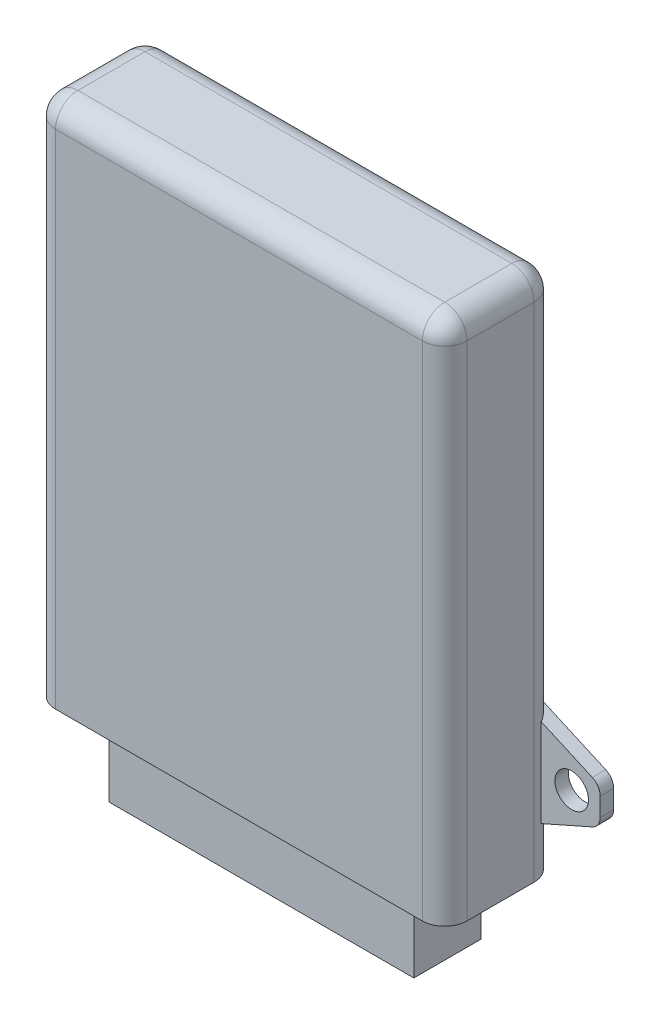
ISO-10303-21;
HEADER;
FILE_DESCRIPTION(('STEP AP214'),'2;1');
FILE_NAME('part.step','',(''),(''),'','','');
FILE_SCHEMA(('AUTOMOTIVE_DESIGN { 1 0 10303 214 1 1 1 1 }'));
ENDSEC;
DATA;
#1=APPLICATION_CONTEXT('core data for automotive mechanical design processes');
#2=APPLICATION_PROTOCOL_DEFINITION('international standard','automotive_design',2000,#1);
#3=PRODUCT_CONTEXT('',#1,'mechanical');
#4=PRODUCT('Part','Part','',(#3));
#5=PRODUCT_RELATED_PRODUCT_CATEGORY('part','',(#4));
#6=PRODUCT_DEFINITION_FORMATION('','',#4);
#7=PRODUCT_DEFINITION_CONTEXT('part definition',#1,'design');
#8=PRODUCT_DEFINITION('design','',#6,#7);
#9=PRODUCT_DEFINITION_SHAPE('','',#8);
#10=(LENGTH_UNIT() NAMED_UNIT(*) SI_UNIT(.MILLI.,.METRE.));
#11=(NAMED_UNIT(*) PLANE_ANGLE_UNIT() SI_UNIT($,.RADIAN.));
#12=(NAMED_UNIT(*) SI_UNIT($,.STERADIAN.) SOLID_ANGLE_UNIT());
#13=UNCERTAINTY_MEASURE_WITH_UNIT(LENGTH_MEASURE(1.E-05),#10,'distance_accuracy_value','');
#14=(GEOMETRIC_REPRESENTATION_CONTEXT(3) GLOBAL_UNCERTAINTY_ASSIGNED_CONTEXT((#13)) GLOBAL_UNIT_ASSIGNED_CONTEXT((#10,
#11,#12)) REPRESENTATION_CONTEXT('',''));
#15=CARTESIAN_POINT('',(0.,0.,0.));
#16=DIRECTION('',(0.,0.,1.));
#17=DIRECTION('',(1.,0.,0.));
#18=AXIS2_PLACEMENT_3D('',#15,#16,#17);
#19=CARTESIAN_POINT('',(-37.9333333333333,60.9946666666666,5.));
#20=DIRECTION('',(0.,1.,0.));
#21=DIRECTION('',(-1.,0.,0.));
#22=AXIS2_PLACEMENT_3D('',#19,#20,#21);
#23=CYLINDRICAL_SURFACE('',#22,5.);
#24=DIRECTION('',(0.,1.,0.));
#25=VECTOR('',#24,1.);
#26=CARTESIAN_POINT('',(-42.5159090282892,60.9946666666666,3.));
#27=LINE('',#26,#25);
#28=CARTESIAN_POINT('',(-42.5159090282892,-41.1726781142199,3.));
#29=VERTEX_POINT('',#28);
#30=CARTESIAN_POINT('',(-42.5159090282892,-21.442223957735,3.));
#31=VERTEX_POINT('',#30);
#32=EDGE_CURVE('E41',#29,#31,#27,.T.);
#33=ORIENTED_EDGE('',*,*,#32,.F.);
#34=CARTESIAN_POINT('',(-37.9333333333333,-43.2073581693863,5.));
#35=DIRECTION('',(0.405801975591513,0.913961025758771,0.));
#36=DIRECTION('',(-0.913961025758771,0.405801975591513,0.));
#37=AXIS2_PLACEMENT_3D('',#34,#35,#36);
#38=ELLIPSE('',#37,5.47069279660913,5.);
#39=CARTESIAN_POINT('',(-37.9333333333333,-43.2073581693863,0.));
#40=VERTEX_POINT('',#39);
#41=EDGE_CURVE('E11',#29,#40,#38,.F.);
#42=ORIENTED_EDGE('',*,*,#41,.T.);
#43=DIRECTION('',(0.,-1.,0.));
#44=VECTOR('',#43,1.);
#45=CARTESIAN_POINT('',(-37.9333333333333,60.9946666666666,0.));
#46=LINE('',#45,#44);
#47=CARTESIAN_POINT('',(-37.9333333333333,-51.3053333333333,0.));
#48=VERTEX_POINT('',#47);
#49=EDGE_CURVE('E389',#48,#40,#46,.F.);
#50=ORIENTED_EDGE('',*,*,#49,.F.);
#51=CARTESIAN_POINT('',(-37.9333333333333,-51.3053333333333,5.));
#52=DIRECTION('',(0.,1.,0.));
#53=DIRECTION('',(0.,0.,1.));
#54=AXIS2_PLACEMENT_3D('',#51,#52,#53);
#55=CIRCLE('',#54,5.);
#56=CARTESIAN_POINT('',(-42.9333333333333,-51.3053333333333,5.));
#57=VERTEX_POINT('',#56);
#58=EDGE_CURVE('E398',#57,#48,#55,.F.);
#59=ORIENTED_EDGE('',*,*,#58,.F.);
#60=DIRECTION('',(0.,-1.,0.));
#61=VECTOR('',#60,1.);
#62=CARTESIAN_POINT('',(-42.9333333333333,-51.3053333333333,5.));
#63=LINE('',#62,#61);
#64=CARTESIAN_POINT('',(-42.9333333333333,60.9946666666666,5.));
#65=VERTEX_POINT('',#64);
#66=EDGE_CURVE('E410',#65,#57,#63,.T.);
#67=ORIENTED_EDGE('',*,*,#66,.F.);
#68=CARTESIAN_POINT('',(-37.9333333333333,60.9946666666667,5.));
#69=DIRECTION('',(0.,1.,0.));
#70=DIRECTION('',(-1.,0.,0.));
#71=AXIS2_PLACEMENT_3D('',#68,#69,#70);
#72=CIRCLE('',#71,5.);
#73=CARTESIAN_POINT('',(-37.9333333333333,60.9946666666667,0.));
#74=VERTEX_POINT('',#73);
#75=EDGE_CURVE('E381',#74,#65,#72,.T.);
#76=ORIENTED_EDGE('',*,*,#75,.F.);
#77=CARTESIAN_POINT('',(-37.9333333333333,-19.4035030737519,0.));
#78=VERTEX_POINT('',#77);
#79=EDGE_CURVE('E376',#78,#74,#46,.F.);
#80=ORIENTED_EDGE('',*,*,#79,.F.);
#81=CARTESIAN_POINT('',(-37.9333333333333,-19.4035030737519,5.));
#82=DIRECTION('',(0.406474844884084,-0.913661972764797,0.));
#83=DIRECTION('',(0.913661972764797,0.406474844884084,0.));
#84=AXIS2_PLACEMENT_3D('',#81,#82,#83);
#85=ELLIPSE('',#84,5.47248342280209,5.);
#86=EDGE_CURVE('E428',#78,#31,#85,.F.);
#87=ORIENTED_EDGE('',*,*,#86,.T.);
#88=EDGE_LOOP('',(#33,#42,#50,#59,#67,#76,#80,#87));
#89=FACE_BOUND('',#88,.T.);
#90=ADVANCED_FACE('F34',(#89),#23,.T.);
#91=CARTESIAN_POINT('',(-42.9333333333333,-51.3053333333333,25.));
#92=DIRECTION('',(0.,1.,0.));
#93=DIRECTION('',(0.,0.,1.));
#94=AXIS2_PLACEMENT_3D('',#91,#92,#93);
#95=PLANE('',#94);
#96=DIRECTION('',(1.,0.,0.));
#97=VECTOR('',#96,1.);
#98=CARTESIAN_POINT('',(-42.9333333333333,-51.3053333333333,0.));
#99=LINE('',#98,#97);
#100=CARTESIAN_POINT('',(44.0666666666667,-51.3053333333333,0.));
#101=VERTEX_POINT('',#100);
#102=EDGE_CURVE('E334',#48,#101,#99,.T.);
#103=ORIENTED_EDGE('',*,*,#102,.T.);
#104=CARTESIAN_POINT('',(44.0666666666667,-51.3053333333333,5.));
#105=DIRECTION('',(0.,1.,0.));
#106=DIRECTION('',(0.,0.,1.));
#107=AXIS2_PLACEMENT_3D('',#104,#105,#106);
#108=CIRCLE('',#107,5.);
#109=CARTESIAN_POINT('',(49.0666666666667,-51.3053333333333,5.));
#110=VERTEX_POINT('',#109);
#111=EDGE_CURVE('E400',#101,#110,#108,.F.);
#112=ORIENTED_EDGE('',*,*,#111,.T.);
#113=DIRECTION('',(0.,0.,-1.));
#114=VECTOR('',#113,1.);
#115=CARTESIAN_POINT('',(49.0666666666667,-51.3053333333333,25.));
#116=LINE('',#115,#114);
#117=CARTESIAN_POINT('',(49.0666666666667,-51.3053333333333,20.));
#118=VERTEX_POINT('',#117);
#119=EDGE_CURVE('E345',#118,#110,#116,.T.);
#120=ORIENTED_EDGE('',*,*,#119,.F.);
#121=CARTESIAN_POINT('',(44.0666666666667,-51.3053333333333,20.));
#122=DIRECTION('',(0.,1.,0.));
#123=DIRECTION('',(0.,0.,1.));
#124=AXIS2_PLACEMENT_3D('',#121,#122,#123);
#125=CIRCLE('',#124,5.);
#126=CARTESIAN_POINT('',(44.0666666666667,-51.3053333333333,25.));
#127=VERTEX_POINT('',#126);
#128=EDGE_CURVE('E360',#118,#127,#125,.F.);
#129=ORIENTED_EDGE('',*,*,#128,.T.);
#130=DIRECTION('',(1.,0.,0.));
#131=VECTOR('',#130,1.);
#132=CARTESIAN_POINT('',(-42.9333333333333,-51.3053333333333,25.));
#133=LINE('',#132,#131);
#134=CARTESIAN_POINT('',(-37.9333333333333,-51.3053333333333,25.));
#135=VERTEX_POINT('',#134);
#136=EDGE_CURVE('E330',#135,#127,#133,.T.);
#137=ORIENTED_EDGE('',*,*,#136,.F.);
#138=CARTESIAN_POINT('',(-37.9333333333333,-51.3053333333333,20.));
#139=DIRECTION('',(0.,1.,0.));
#140=DIRECTION('',(0.,0.,1.));
#141=AXIS2_PLACEMENT_3D('',#138,#139,#140);
#142=CIRCLE('',#141,5.);
#143=CARTESIAN_POINT('',(-42.9333333333333,-51.3053333333333,20.));
#144=VERTEX_POINT('',#143);
#145=EDGE_CURVE('E358',#135,#144,#142,.F.);
#146=ORIENTED_EDGE('',*,*,#145,.T.);
#147=DIRECTION('',(0.,0.,-1.));
#148=VECTOR('',#147,1.);
#149=CARTESIAN_POINT('',(-42.9333333333333,-51.3053333333333,25.));
#150=LINE('',#149,#148);
#151=EDGE_CURVE('E342',#144,#57,#150,.T.);
#152=ORIENTED_EDGE('',*,*,#151,.T.);
#153=ORIENTED_EDGE('',*,*,#58,.T.);
#154=EDGE_LOOP('',(#103,#112,#120,#129,#137,#146,#152,#153));
#155=FACE_BOUND('',#154,.T.);
#156=DIRECTION('',(0.,0.,-1.));
#157=VECTOR('',#156,1.);
#158=CARTESIAN_POINT('',(-31.0333333333333,-51.3053333333333,20.));
#159=LINE('',#158,#157);
#160=CARTESIAN_POINT('',(-31.0333333333333,-51.3053333333333,20.));
#161=VERTEX_POINT('',#160);
#162=CARTESIAN_POINT('',(-31.0333333333333,-51.3053333333333,5.));
#163=VERTEX_POINT('',#162);
#164=EDGE_CURVE('E290',#161,#163,#159,.T.);
#165=ORIENTED_EDGE('',*,*,#164,.F.);
#166=DIRECTION('',(-1.,0.,0.));
#167=VECTOR('',#166,1.);
#168=CARTESIAN_POINT('',(-31.0333333333333,-51.3053333333333,20.));
#169=LINE('',#168,#167);
#170=CARTESIAN_POINT('',(37.1666666666667,-51.3053333333333,20.));
#171=VERTEX_POINT('',#170);
#172=EDGE_CURVE('E301',#171,#161,#169,.T.);
#173=ORIENTED_EDGE('',*,*,#172,.F.);
#174=DIRECTION('',(0.,0.,1.));
#175=VECTOR('',#174,1.);
#176=CARTESIAN_POINT('',(37.1666666666667,-51.3053333333333,20.));
#177=LINE('',#176,#175);
#178=CARTESIAN_POINT('',(37.1666666666667,-51.3053333333333,5.));
#179=VERTEX_POINT('',#178);
#180=EDGE_CURVE('E313',#179,#171,#177,.T.);
#181=ORIENTED_EDGE('',*,*,#180,.F.);
#182=DIRECTION('',(1.,0.,0.));
#183=VECTOR('',#182,1.);
#184=CARTESIAN_POINT('',(-31.0333333333333,-51.3053333333333,5.));
#185=LINE('',#184,#183);
#186=EDGE_CURVE('E310',#163,#179,#185,.T.);
#187=ORIENTED_EDGE('',*,*,#186,.F.);
#188=EDGE_LOOP('',(#165,#173,#181,#187));
#189=FACE_BOUND('',#188,.T.);
#190=ADVANCED_FACE('F450',(#155,#189),#95,.F.);
#191=CARTESIAN_POINT('',(-37.9333333333333,60.9946666666667,25.));
#192=DIRECTION('',(0.,0.,-1.));
#193=DIRECTION('',(-1.,0.,0.));
#194=AXIS2_PLACEMENT_3D('',#191,#192,#193);
#195=CYLINDRICAL_SURFACE('',#194,5.);
#196=DIRECTION('',(0.,0.,-1.));
#197=VECTOR('',#196,1.);
#198=CARTESIAN_POINT('',(-37.9333333333333,65.9946666666667,25.));
#199=LINE('',#198,#197);
#200=CARTESIAN_POINT('',(-37.9333333333333,65.9946666666667,20.));
#201=VERTEX_POINT('',#200);
#202=CARTESIAN_POINT('',(-37.9333333333333,65.9946666666667,5.));
#203=VERTEX_POINT('',#202);
#204=EDGE_CURVE('E333',#201,#203,#199,.T.);
#205=ORIENTED_EDGE('',*,*,#204,.T.);
#206=CARTESIAN_POINT('',(-37.9333333333333,60.9946666666667,5.));
#207=DIRECTION('',(0.,0.,-1.));
#208=DIRECTION('',(-1.,0.,0.));
#209=AXIS2_PLACEMENT_3D('',#206,#207,#208);
#210=CIRCLE('',#209,5.);
#211=EDGE_CURVE('E408',#203,#65,#210,.F.);
#212=ORIENTED_EDGE('',*,*,#211,.T.);
#213=DIRECTION('',(0.,0.,-1.));
#214=VECTOR('',#213,1.);
#215=CARTESIAN_POINT('',(-42.9333333333333,60.9946666666666,25.));
#216=LINE('',#215,#214);
#217=CARTESIAN_POINT('',(-42.9333333333333,60.9946666666666,20.));
#218=VERTEX_POINT('',#217);
#219=EDGE_CURVE('E338',#218,#65,#216,.T.);
#220=ORIENTED_EDGE('',*,*,#219,.F.);
#221=CARTESIAN_POINT('',(-37.9333333333333,60.9946666666667,20.));
#222=DIRECTION('',(0.,0.,-1.));
#223=DIRECTION('',(-1.,0.,0.));
#224=AXIS2_PLACEMENT_3D('',#221,#222,#223);
#225=CIRCLE('',#224,5.);
#226=EDGE_CURVE('E372',#218,#201,#225,.T.);
#227=ORIENTED_EDGE('',*,*,#226,.T.);
#228=EDGE_LOOP('',(#205,#212,#220,#227));
#229=FACE_BOUND('',#228,.T.);
#230=ADVANCED_FACE('F508',(#229),#195,.T.);
#231=CARTESIAN_POINT('',(-42.9333333333333,60.9946666666666,25.));
#232=DIRECTION('',(1.,0.,0.));
#233=DIRECTION('',(0.,1.,0.));
#234=AXIS2_PLACEMENT_3D('',#231,#232,#233);
#235=PLANE('',#234);
#236=ORIENTED_EDGE('',*,*,#219,.T.);
#237=ORIENTED_EDGE('',*,*,#66,.T.);
#238=ORIENTED_EDGE('',*,*,#151,.F.);
#239=DIRECTION('',(0.,-1.,0.));
#240=VECTOR('',#239,1.);
#241=CARTESIAN_POINT('',(-42.9333333333333,60.9946666666666,20.));
#242=LINE('',#241,#240);
#243=EDGE_CURVE('E374',#144,#218,#242,.F.);
#244=ORIENTED_EDGE('',*,*,#243,.T.);
#245=EDGE_LOOP('',(#236,#237,#238,#244));
#246=FACE_BOUND('',#245,.T.);
#247=ADVANCED_FACE('F528',(#246),#235,.F.);
#248=CARTESIAN_POINT('',(49.0666666666667,60.9946666666666,25.));
#249=DIRECTION('',(1.,0.,0.));
#250=DIRECTION('',(0.,1.,0.));
#251=AXIS2_PLACEMENT_3D('',#248,#249,#250);
#252=PLANE('',#251);
#253=ORIENTED_EDGE('',*,*,#119,.T.);
#254=DIRECTION('',(0.,-1.,0.));
#255=VECTOR('',#254,1.);
#256=CARTESIAN_POINT('',(49.0666666666667,60.9946666666666,5.));
#257=LINE('',#256,#255);
#258=CARTESIAN_POINT('',(49.0666666666667,60.9946666666666,5.));
#259=VERTEX_POINT('',#258);
#260=EDGE_CURVE('E402',#110,#259,#257,.F.);
#261=ORIENTED_EDGE('',*,*,#260,.T.);
#262=DIRECTION('',(0.,0.,-1.));
#263=VECTOR('',#262,1.);
#264=CARTESIAN_POINT('',(49.0666666666667,60.9946666666666,25.));
#265=LINE('',#264,#263);
#266=CARTESIAN_POINT('',(49.0666666666667,60.9946666666666,20.));
#267=VERTEX_POINT('',#266);
#268=EDGE_CURVE('E348',#267,#259,#265,.T.);
#269=ORIENTED_EDGE('',*,*,#268,.F.);
#270=DIRECTION('',(0.,-1.,0.));
#271=VECTOR('',#270,1.);
#272=CARTESIAN_POINT('',(49.0666666666667,-51.3053333333333,20.));
#273=LINE('',#272,#271);
#274=EDGE_CURVE('E341',#267,#118,#273,.T.);
#275=ORIENTED_EDGE('',*,*,#274,.T.);
#276=EDGE_LOOP('',(#253,#261,#269,#275));
#277=FACE_BOUND('',#276,.T.);
#278=ADVANCED_FACE('F461',(#277),#252,.T.);
#279=CARTESIAN_POINT('',(44.0666666666667,60.9946666666667,25.));
#280=DIRECTION('',(0.,0.,-1.));
#281=DIRECTION('',(-1.,0.,0.));
#282=AXIS2_PLACEMENT_3D('',#279,#280,#281);
#283=CYLINDRICAL_SURFACE('',#282,5.);
#284=ORIENTED_EDGE('',*,*,#268,.T.);
#285=CARTESIAN_POINT('',(44.0666666666667,60.9946666666667,5.));
#286=DIRECTION('',(0.,0.,-1.));
#287=DIRECTION('',(-1.,0.,0.));
#288=AXIS2_PLACEMENT_3D('',#285,#286,#287);
#289=CIRCLE('',#288,5.);
#290=CARTESIAN_POINT('',(44.0666666666666,65.9946666666667,5.));
#291=VERTEX_POINT('',#290);
#292=EDGE_CURVE('E404',#259,#291,#289,.F.);
#293=ORIENTED_EDGE('',*,*,#292,.T.);
#294=DIRECTION('',(0.,0.,-1.));
#295=VECTOR('',#294,1.);
#296=CARTESIAN_POINT('',(44.0666666666666,65.9946666666667,25.));
#297=LINE('',#296,#295);
#298=CARTESIAN_POINT('',(44.0666666666666,65.9946666666667,20.));
#299=VERTEX_POINT('',#298);
#300=EDGE_CURVE('E351',#299,#291,#297,.T.);
#301=ORIENTED_EDGE('',*,*,#300,.F.);
#302=CARTESIAN_POINT('',(44.0666666666667,60.9946666666667,20.));
#303=DIRECTION('',(0.,0.,-1.));
#304=DIRECTION('',(-1.,0.,0.));
#305=AXIS2_PLACEMENT_3D('',#302,#303,#304);
#306=CIRCLE('',#305,5.);
#307=EDGE_CURVE('E368',#299,#267,#306,.T.);
#308=ORIENTED_EDGE('',*,*,#307,.T.);
#309=EDGE_LOOP('',(#284,#293,#301,#308));
#310=FACE_BOUND('',#309,.T.);
#311=ADVANCED_FACE('F493',(#310),#283,.T.);
#312=CARTESIAN_POINT('',(-37.9333333333333,65.9946666666667,25.));
#313=DIRECTION('',(0.,1.,0.));
#314=DIRECTION('',(0.,0.,1.));
#315=AXIS2_PLACEMENT_3D('',#312,#313,#314);
#316=PLANE('',#315);
#317=ORIENTED_EDGE('',*,*,#300,.T.);
#318=DIRECTION('',(1.,0.,0.));
#319=VECTOR('',#318,1.);
#320=CARTESIAN_POINT('',(-37.9333333333333,65.9946666666667,5.));
#321=LINE('',#320,#319);
#322=EDGE_CURVE('E406',#291,#203,#321,.F.);
#323=ORIENTED_EDGE('',*,*,#322,.T.);
#324=ORIENTED_EDGE('',*,*,#204,.F.);
#325=DIRECTION('',(1.,0.,0.));
#326=VECTOR('',#325,1.);
#327=CARTESIAN_POINT('',(44.0666666666666,65.9946666666667,20.));
#328=LINE('',#327,#326);
#329=EDGE_CURVE('E370',#201,#299,#328,.T.);
#330=ORIENTED_EDGE('',*,*,#329,.T.);
#331=EDGE_LOOP('',(#317,#323,#324,#330));
#332=FACE_BOUND('',#331,.T.);
#333=ADVANCED_FACE('F490',(#332),#316,.T.);
#334=CARTESIAN_POINT('',(-37.9333333333333,60.9946666666667,25.));
#335=DIRECTION('',(0.,0.,-1.));
#336=DIRECTION('',(-1.,0.,0.));
#337=AXIS2_PLACEMENT_3D('',#334,#335,#336);
#338=PLANE('',#337);
#339=ORIENTED_EDGE('',*,*,#136,.T.);
#340=DIRECTION('',(0.,-1.,0.));
#341=VECTOR('',#340,1.);
#342=CARTESIAN_POINT('',(44.0666666666667,60.9946666666666,25.));
#343=LINE('',#342,#341);
#344=CARTESIAN_POINT('',(44.0666666666667,60.9946666666667,25.));
#345=VERTEX_POINT('',#344);
#346=EDGE_CURVE('E366',#127,#345,#343,.F.);
#347=ORIENTED_EDGE('',*,*,#346,.T.);
#348=DIRECTION('',(1.,0.,0.));
#349=VECTOR('',#348,1.);
#350=CARTESIAN_POINT('',(-37.9333333333333,60.9946666666667,25.));
#351=LINE('',#350,#349);
#352=CARTESIAN_POINT('',(-37.9333333333333,60.9946666666667,25.));
#353=VERTEX_POINT('',#352);
#354=EDGE_CURVE('E364',#345,#353,#351,.F.);
#355=ORIENTED_EDGE('',*,*,#354,.T.);
#356=DIRECTION('',(0.,-1.,0.));
#357=VECTOR('',#356,1.);
#358=CARTESIAN_POINT('',(-37.9333333333333,60.9946666666667,25.));
#359=LINE('',#358,#357);
#360=EDGE_CURVE('E362',#353,#135,#359,.T.);
#361=ORIENTED_EDGE('',*,*,#360,.T.);
#362=EDGE_LOOP('',(#339,#347,#355,#361));
#363=FACE_BOUND('',#362,.T.);
#364=ADVANCED_FACE('F471',(#363),#338,.F.);
#365=CARTESIAN_POINT('',(-37.9333333333333,60.9946666666667,0.));
#366=DIRECTION('',(0.,0.,-1.));
#367=DIRECTION('',(-1.,0.,0.));
#368=AXIS2_PLACEMENT_3D('',#365,#366,#367);
#369=PLANE('',#368);
#370=ORIENTED_EDGE('',*,*,#49,.T.);
#371=DIRECTION('',(0.913961025758771,-0.405801975591513,0.));
#372=VECTOR('',#371,1.);
#373=CARTESIAN_POINT('',(-53.9300748398216,-36.1047475291016,0.));
#374=LINE('',#373,#372);
#375=CARTESIAN_POINT('',(-53.9300748398216,-36.1047475291016,0.));
#376=VERTEX_POINT('',#375);
#377=EDGE_CURVE('E242',#376,#40,#374,.T.);
#378=ORIENTED_EDGE('',*,*,#377,.F.);
#379=CARTESIAN_POINT('',(-52.712668913047,-33.3628644518253,0.));
#380=DIRECTION('',(0.,0.,1.));
#381=DIRECTION('',(-1.,0.,0.));
#382=AXIS2_PLACEMENT_3D('',#379,#380,#381);
#383=CIRCLE('',#382,3.);
#384=CARTESIAN_POINT('',(-55.712668913047,-33.3628644518253,0.));
#385=VERTEX_POINT('',#384);
#386=EDGE_CURVE('E224',#385,#376,#383,.T.);
#387=ORIENTED_EDGE('',*,*,#386,.F.);
#388=DIRECTION('',(0.,-1.,0.));
#389=VECTOR('',#388,1.);
#390=CARTESIAN_POINT('',(-55.712668913047,-29.2621033063926,0.));
#391=LINE('',#390,#389);
#392=CARTESIAN_POINT('',(-55.712668913047,-29.2621033063926,0.));
#393=VERTEX_POINT('',#392);
#394=EDGE_CURVE('E246',#393,#385,#391,.T.);
#395=ORIENTED_EDGE('',*,*,#394,.F.);
#396=CARTESIAN_POINT('',(-52.712668913047,-29.2621033063926,0.));
#397=DIRECTION('',(0.,0.,1.));
#398=DIRECTION('',(-1.,0.,0.));
#399=AXIS2_PLACEMENT_3D('',#396,#397,#398);
#400=CIRCLE('',#399,3.);
#401=CARTESIAN_POINT('',(-53.9320934476993,-26.5211173880982,0.));
#402=VERTEX_POINT('',#401);
#403=EDGE_CURVE('E232',#402,#393,#400,.T.);
#404=ORIENTED_EDGE('',*,*,#403,.F.);
#405=DIRECTION('',(-0.913661972764797,-0.406474844884084,0.));
#406=VECTOR('',#405,1.);
#407=CARTESIAN_POINT('',(-53.9320934476993,-26.5211173880982,0.));
#408=LINE('',#407,#406);
#409=EDGE_CURVE('E230',#78,#402,#408,.T.);
#410=ORIENTED_EDGE('',*,*,#409,.F.);
#411=ORIENTED_EDGE('',*,*,#79,.T.);
#412=DIRECTION('',(1.,0.,0.));
#413=VECTOR('',#412,1.);
#414=CARTESIAN_POINT('',(-37.9333333333333,60.9946666666667,0.));
#415=LINE('',#414,#413);
#416=CARTESIAN_POINT('',(44.0666666666667,60.9946666666667,0.));
#417=VERTEX_POINT('',#416);
#418=EDGE_CURVE('E392',#74,#417,#415,.T.);
#419=ORIENTED_EDGE('',*,*,#418,.T.);
#420=DIRECTION('',(0.,-1.,0.));
#421=VECTOR('',#420,1.);
#422=CARTESIAN_POINT('',(44.0666666666667,60.9946666666667,0.));
#423=LINE('',#422,#421);
#424=CARTESIAN_POINT('',(44.0666666666667,-19.4035030737519,0.));
#425=VERTEX_POINT('',#424);
#426=EDGE_CURVE('E395',#417,#425,#423,.T.);
#427=ORIENTED_EDGE('',*,*,#426,.T.);
#428=DIRECTION('',(0.913661972764797,-0.406474844884084,0.));
#429=VECTOR('',#428,1.);
#430=CARTESIAN_POINT('',(60.0654267810326,-26.5211173880982,0.));
#431=LINE('',#430,#429);
#432=CARTESIAN_POINT('',(60.0654267810326,-26.5211173880982,0.));
#433=VERTEX_POINT('',#432);
#434=EDGE_CURVE('E279',#425,#433,#431,.T.);
#435=ORIENTED_EDGE('',*,*,#434,.T.);
#436=CARTESIAN_POINT('',(58.8460022463804,-29.2621033063926,0.));
#437=DIRECTION('',(0.,0.,-1.));
#438=DIRECTION('',(1.,0.,0.));
#439=AXIS2_PLACEMENT_3D('',#436,#437,#438);
#440=CIRCLE('',#439,3.);
#441=CARTESIAN_POINT('',(61.8460022463804,-29.2621033063926,0.));
#442=VERTEX_POINT('',#441);
#443=EDGE_CURVE('E281',#433,#442,#440,.T.);
#444=ORIENTED_EDGE('',*,*,#443,.T.);
#445=DIRECTION('',(0.,-1.,0.));
#446=VECTOR('',#445,1.);
#447=CARTESIAN_POINT('',(61.8460022463804,-29.2621033063926,0.));
#448=LINE('',#447,#446);
#449=CARTESIAN_POINT('',(61.8460022463804,-33.3628644518253,0.));
#450=VERTEX_POINT('',#449);
#451=EDGE_CURVE('E284',#442,#450,#448,.T.);
#452=ORIENTED_EDGE('',*,*,#451,.T.);
#453=CARTESIAN_POINT('',(58.8460022463804,-33.3628644518253,0.));
#454=DIRECTION('',(0.,0.,-1.));
#455=DIRECTION('',(1.,0.,0.));
#456=AXIS2_PLACEMENT_3D('',#453,#454,#455);
#457=CIRCLE('',#456,3.);
#458=CARTESIAN_POINT('',(60.0634081731549,-36.1047475291016,0.));
#459=VERTEX_POINT('',#458);
#460=EDGE_CURVE('E266',#450,#459,#457,.T.);
#461=ORIENTED_EDGE('',*,*,#460,.T.);
#462=DIRECTION('',(-0.913961025758771,-0.405801975591513,0.));
#463=VECTOR('',#462,1.);
#464=CARTESIAN_POINT('',(60.0634081731549,-36.1047475291016,0.));
#465=LINE('',#464,#463);
#466=CARTESIAN_POINT('',(44.0666666666667,-43.2073581693862,0.));
#467=VERTEX_POINT('',#466);
#468=EDGE_CURVE('E56',#459,#467,#465,.T.);
#469=ORIENTED_EDGE('',*,*,#468,.T.);
#470=EDGE_CURVE('E394',#467,#101,#423,.T.);
#471=ORIENTED_EDGE('',*,*,#470,.T.);
#472=ORIENTED_EDGE('',*,*,#102,.F.);
#473=EDGE_LOOP('',(#370,#378,#387,#395,#404,#410,#411,#419,#427,#435,#444,#452,#461,#469,#471,#472));
#474=FACE_BOUND('',#473,.T.);
#475=CARTESIAN_POINT('',(-49.3230011231902,-31.312483879109,0.));
#476=DIRECTION('',(0.,0.,1.));
#477=DIRECTION('',(1.,0.,0.));
#478=AXIS2_PLACEMENT_3D('',#475,#476,#477);
#479=CIRCLE('',#478,3.75);
#480=CARTESIAN_POINT('',(-45.5730011231902,-31.312483879109,0.));
#481=VERTEX_POINT('',#480);
#482=EDGE_CURVE('E235',#481,#481,#479,.T.);
#483=ORIENTED_EDGE('',*,*,#482,.T.);
#484=EDGE_LOOP('',(#483));
#485=FACE_BOUND('',#484,.T.);
#486=CARTESIAN_POINT('',(55.4563344565235,-31.3124838791089,0.));
#487=DIRECTION('',(0.,0.,-1.));
#488=DIRECTION('',(-1.,0.,0.));
#489=AXIS2_PLACEMENT_3D('',#486,#487,#488);
#490=CIRCLE('',#489,3.75);
#491=CARTESIAN_POINT('',(51.7063344565235,-31.3124838791089,0.));
#492=VERTEX_POINT('',#491);
#493=EDGE_CURVE('E252',#492,#492,#490,.T.);
#494=ORIENTED_EDGE('',*,*,#493,.F.);
#495=EDGE_LOOP('',(#494));
#496=FACE_BOUND('',#495,.T.);
#497=ADVANCED_FACE('F436',(#474,#485,#496),#369,.T.);
#498=CARTESIAN_POINT('',(-37.9333333333333,60.9946666666667,20.));
#499=DIRECTION('',(0.,-1.,0.));
#500=DIRECTION('',(1.,0.,0.));
#501=AXIS2_PLACEMENT_3D('',#498,#499,#500);
#502=CYLINDRICAL_SURFACE('',#501,5.);
#503=CARTESIAN_POINT('',(-37.9333333333333,60.9946666666666,20.));
#504=DIRECTION('',(0.,1.,0.));
#505=DIRECTION('',(0.,0.,1.));
#506=AXIS2_PLACEMENT_3D('',#503,#504,#505);
#507=CIRCLE('',#506,5.);
#508=EDGE_CURVE('E337',#218,#353,#507,.T.);
#509=ORIENTED_EDGE('',*,*,#508,.F.);
#510=ORIENTED_EDGE('',*,*,#243,.F.);
#511=ORIENTED_EDGE('',*,*,#145,.F.);
#512=ORIENTED_EDGE('',*,*,#360,.F.);
#513=EDGE_LOOP('',(#509,#510,#511,#512));
#514=FACE_BOUND('',#513,.T.);
#515=ADVANCED_FACE('F476',(#514),#502,.T.);
#516=CARTESIAN_POINT('',(-37.9333333333333,60.9946666666667,20.));
#517=DIRECTION('',(0.,0.,-1.));
#518=DIRECTION('',(-1.,0.,0.));
#519=AXIS2_PLACEMENT_3D('',#516,#517,#518);
#520=SPHERICAL_SURFACE('',#519,5.);
#521=ORIENTED_EDGE('',*,*,#226,.F.);
#522=ORIENTED_EDGE('',*,*,#508,.T.);
#523=CARTESIAN_POINT('',(-37.9333333333333,60.9946666666667,20.));
#524=DIRECTION('',(1.,0.,0.));
#525=DIRECTION('',(0.,1.,0.));
#526=AXIS2_PLACEMENT_3D('',#523,#524,#525);
#527=CIRCLE('',#526,5.);
#528=EDGE_CURVE('E384',#201,#353,#527,.T.);
#529=ORIENTED_EDGE('',*,*,#528,.F.);
#530=EDGE_LOOP('',(#521,#522,#529));
#531=FACE_BOUND('',#530,.T.);
#532=ADVANCED_FACE('F481',(#531),#520,.T.);
#533=CARTESIAN_POINT('',(-37.9333333333333,60.9946666666667,20.));
#534=DIRECTION('',(-1.,0.,0.));
#535=DIRECTION('',(0.,0.,1.));
#536=AXIS2_PLACEMENT_3D('',#533,#534,#535);
#537=CYLINDRICAL_SURFACE('',#536,5.);
#538=CARTESIAN_POINT('',(44.0666666666666,60.9946666666667,20.));
#539=DIRECTION('',(1.,0.,0.));
#540=DIRECTION('',(0.,0.,-1.));
#541=AXIS2_PLACEMENT_3D('',#538,#539,#540);
#542=CIRCLE('',#541,5.);
#543=EDGE_CURVE('E380',#299,#345,#542,.T.);
#544=ORIENTED_EDGE('',*,*,#543,.F.);
#545=ORIENTED_EDGE('',*,*,#329,.F.);
#546=ORIENTED_EDGE('',*,*,#528,.T.);
#547=ORIENTED_EDGE('',*,*,#354,.F.);
#548=EDGE_LOOP('',(#544,#545,#546,#547));
#549=FACE_BOUND('',#548,.T.);
#550=ADVANCED_FACE('F485',(#549),#537,.T.);
#551=CARTESIAN_POINT('',(44.0666666666667,60.9946666666667,20.));
#552=DIRECTION('',(0.,0.,-1.));
#553=DIRECTION('',(-1.,0.,0.));
#554=AXIS2_PLACEMENT_3D('',#551,#552,#553);
#555=SPHERICAL_SURFACE('',#554,5.);
#556=ORIENTED_EDGE('',*,*,#307,.F.);
#557=ORIENTED_EDGE('',*,*,#543,.T.);
#558=CARTESIAN_POINT('',(44.0666666666667,60.9946666666667,20.));
#559=DIRECTION('',(0.,-1.,0.));
#560=DIRECTION('',(1.,0.,0.));
#561=AXIS2_PLACEMENT_3D('',#558,#559,#560);
#562=CIRCLE('',#561,5.);
#563=EDGE_CURVE('E377',#267,#345,#562,.T.);
#564=ORIENTED_EDGE('',*,*,#563,.F.);
#565=EDGE_LOOP('',(#556,#557,#564));
#566=FACE_BOUND('',#565,.T.);
#567=ADVANCED_FACE('F518',(#566),#555,.T.);
#568=CARTESIAN_POINT('',(44.0666666666667,60.9946666666666,20.));
#569=DIRECTION('',(0.,1.,0.));
#570=DIRECTION('',(-1.,0.,0.));
#571=AXIS2_PLACEMENT_3D('',#568,#569,#570);
#572=CYLINDRICAL_SURFACE('',#571,5.);
#573=ORIENTED_EDGE('',*,*,#563,.T.);
#574=ORIENTED_EDGE('',*,*,#346,.F.);
#575=ORIENTED_EDGE('',*,*,#128,.F.);
#576=ORIENTED_EDGE('',*,*,#274,.F.);
#577=EDGE_LOOP('',(#573,#574,#575,#576));
#578=FACE_BOUND('',#577,.T.);
#579=ADVANCED_FACE('F466',(#578),#572,.T.);
#580=CARTESIAN_POINT('',(-37.9333333333333,60.9946666666667,5.));
#581=DIRECTION('',(0.,0.,-1.));
#582=DIRECTION('',(-1.,0.,0.));
#583=AXIS2_PLACEMENT_3D('',#580,#581,#582);
#584=SPHERICAL_SURFACE('',#583,5.);
#585=ORIENTED_EDGE('',*,*,#75,.T.);
#586=ORIENTED_EDGE('',*,*,#211,.F.);
#587=CARTESIAN_POINT('',(-37.9333333333333,60.9946666666667,5.));
#588=DIRECTION('',(1.,0.,0.));
#589=DIRECTION('',(0.,1.,0.));
#590=AXIS2_PLACEMENT_3D('',#587,#588,#589);
#591=CIRCLE('',#590,5.);
#592=EDGE_CURVE('E418',#74,#203,#591,.T.);
#593=ORIENTED_EDGE('',*,*,#592,.F.);
#594=EDGE_LOOP('',(#585,#586,#593));
#595=FACE_BOUND('',#594,.T.);
#596=ADVANCED_FACE('F511',(#595),#584,.T.);
#597=CARTESIAN_POINT('',(-37.9333333333333,60.9946666666667,5.));
#598=DIRECTION('',(1.,0.,0.));
#599=DIRECTION('',(0.,0.,-1.));
#600=AXIS2_PLACEMENT_3D('',#597,#598,#599);
#601=CYLINDRICAL_SURFACE('',#600,5.);
#602=ORIENTED_EDGE('',*,*,#592,.T.);
#603=ORIENTED_EDGE('',*,*,#322,.F.);
#604=CARTESIAN_POINT('',(44.0666666666667,60.9946666666667,5.));
#605=DIRECTION('',(1.,0.,0.));
#606=DIRECTION('',(0.,1.,0.));
#607=AXIS2_PLACEMENT_3D('',#604,#605,#606);
#608=CIRCLE('',#607,5.);
#609=EDGE_CURVE('E415',#417,#291,#608,.T.);
#610=ORIENTED_EDGE('',*,*,#609,.F.);
#611=ORIENTED_EDGE('',*,*,#418,.F.);
#612=EDGE_LOOP('',(#602,#603,#610,#611));
#613=FACE_BOUND('',#612,.T.);
#614=ADVANCED_FACE('F504',(#613),#601,.T.);
#615=CARTESIAN_POINT('',(44.0666666666667,60.9946666666667,5.));
#616=DIRECTION('',(0.,0.,-1.));
#617=DIRECTION('',(-1.,0.,0.));
#618=AXIS2_PLACEMENT_3D('',#615,#616,#617);
#619=SPHERICAL_SURFACE('',#618,5.);
#620=ORIENTED_EDGE('',*,*,#609,.T.);
#621=ORIENTED_EDGE('',*,*,#292,.F.);
#622=CARTESIAN_POINT('',(44.0666666666667,60.9946666666667,5.));
#623=DIRECTION('',(0.,-1.,0.));
#624=DIRECTION('',(1.,0.,0.));
#625=AXIS2_PLACEMENT_3D('',#622,#623,#624);
#626=CIRCLE('',#625,5.);
#627=EDGE_CURVE('E329',#417,#259,#626,.T.);
#628=ORIENTED_EDGE('',*,*,#627,.F.);
#629=EDGE_LOOP('',(#620,#621,#628));
#630=FACE_BOUND('',#629,.T.);
#631=ADVANCED_FACE('F497',(#630),#619,.T.);
#632=CARTESIAN_POINT('',(44.0666666666667,60.9946666666667,5.));
#633=DIRECTION('',(0.,-1.,0.));
#634=DIRECTION('',(1.,0.,0.));
#635=AXIS2_PLACEMENT_3D('',#632,#633,#634);
#636=CYLINDRICAL_SURFACE('',#635,5.);
#637=CARTESIAN_POINT('',(44.0666666666667,-43.2073581693863,5.));
#638=DIRECTION('',(0.405801975591513,-0.913961025758771,0.));
#639=DIRECTION('',(-0.913961025758771,-0.405801975591514,0.));
#640=AXIS2_PLACEMENT_3D('',#637,#638,#639);
#641=ELLIPSE('',#640,5.47069279660913,5.);
#642=CARTESIAN_POINT('',(48.6492423616225,-41.1726781142199,3.));
#643=VERTEX_POINT('',#642);
#644=EDGE_CURVE('E426',#643,#467,#641,.F.);
#645=ORIENTED_EDGE('',*,*,#644,.F.);
#646=DIRECTION('',(0.,-1.,0.));
#647=VECTOR('',#646,1.);
#648=CARTESIAN_POINT('',(48.6492423616225,60.9946666666667,3.));
#649=LINE('',#648,#647);
#650=CARTESIAN_POINT('',(48.6492423616225,-21.442223957735,3.));
#651=VERTEX_POINT('',#650);
#652=EDGE_CURVE('E412',#651,#643,#649,.T.);
#653=ORIENTED_EDGE('',*,*,#652,.F.);
#654=CARTESIAN_POINT('',(44.0666666666667,-19.4035030737519,5.));
#655=DIRECTION('',(0.406474844884084,0.913661972764797,0.));
#656=DIRECTION('',(0.913661972764797,-0.406474844884084,0.));
#657=AXIS2_PLACEMENT_3D('',#654,#655,#656);
#658=ELLIPSE('',#657,5.47248342280209,5.);
#659=EDGE_CURVE('E424',#425,#651,#658,.F.);
#660=ORIENTED_EDGE('',*,*,#659,.F.);
#661=ORIENTED_EDGE('',*,*,#426,.F.);
#662=ORIENTED_EDGE('',*,*,#627,.T.);
#663=ORIENTED_EDGE('',*,*,#260,.F.);
#664=ORIENTED_EDGE('',*,*,#111,.F.);
#665=ORIENTED_EDGE('',*,*,#470,.F.);
#666=EDGE_LOOP('',(#645,#653,#660,#661,#662,#663,#664,#665));
#667=FACE_BOUND('',#666,.T.);
#668=ADVANCED_FACE('F458',(#667),#636,.T.);
#669=CARTESIAN_POINT('',(-31.0333333333333,-68.3053333333333,20.));
#670=DIRECTION('',(1.,0.,0.));
#671=DIRECTION('',(0.,0.,-1.));
#672=AXIS2_PLACEMENT_3D('',#669,#670,#671);
#673=PLANE('',#672);
#674=ORIENTED_EDGE('',*,*,#164,.T.);
#675=DIRECTION('',(0.,1.,0.));
#676=VECTOR('',#675,1.);
#677=CARTESIAN_POINT('',(-31.0333333333333,-68.3053333333333,5.));
#678=LINE('',#677,#676);
#679=CARTESIAN_POINT('',(-31.0333333333333,-68.3053333333333,5.));
#680=VERTEX_POINT('',#679);
#681=EDGE_CURVE('E326',#680,#163,#678,.T.);
#682=ORIENTED_EDGE('',*,*,#681,.F.);
#683=DIRECTION('',(0.,0.,-1.));
#684=VECTOR('',#683,1.);
#685=CARTESIAN_POINT('',(-31.0333333333333,-68.3053333333333,20.));
#686=LINE('',#685,#684);
#687=CARTESIAN_POINT('',(-31.0333333333333,-68.3053333333333,20.));
#688=VERTEX_POINT('',#687);
#689=EDGE_CURVE('E297',#688,#680,#686,.T.);
#690=ORIENTED_EDGE('',*,*,#689,.F.);
#691=DIRECTION('',(0.,1.,0.));
#692=VECTOR('',#691,1.);
#693=CARTESIAN_POINT('',(-31.0333333333333,-68.3053333333333,20.));
#694=LINE('',#693,#692);
#695=EDGE_CURVE('E307',#688,#161,#694,.T.);
#696=ORIENTED_EDGE('',*,*,#695,.T.);
#697=EDGE_LOOP('',(#674,#682,#690,#696));
#698=FACE_BOUND('',#697,.T.);
#699=ADVANCED_FACE('F550',(#698),#673,.F.);
#700=CARTESIAN_POINT('',(-31.0333333333333,-68.3053333333333,5.));
#701=DIRECTION('',(0.,0.,1.));
#702=DIRECTION('',(1.,0.,0.));
#703=AXIS2_PLACEMENT_3D('',#700,#701,#702);
#704=PLANE('',#703);
#705=ORIENTED_EDGE('',*,*,#186,.T.);
#706=DIRECTION('',(0.,1.,0.));
#707=VECTOR('',#706,1.);
#708=CARTESIAN_POINT('',(37.1666666666667,-68.3053333333333,5.));
#709=LINE('',#708,#707);
#710=CARTESIAN_POINT('',(37.1666666666667,-68.3053333333333,5.));
#711=VERTEX_POINT('',#710);
#712=EDGE_CURVE('E323',#711,#179,#709,.T.);
#713=ORIENTED_EDGE('',*,*,#712,.F.);
#714=DIRECTION('',(1.,0.,0.));
#715=VECTOR('',#714,1.);
#716=CARTESIAN_POINT('',(-31.0333333333333,-68.3053333333333,5.));
#717=LINE('',#716,#715);
#718=EDGE_CURVE('E300',#680,#711,#717,.T.);
#719=ORIENTED_EDGE('',*,*,#718,.F.);
#720=ORIENTED_EDGE('',*,*,#681,.T.);
#721=EDGE_LOOP('',(#705,#713,#719,#720));
#722=FACE_BOUND('',#721,.T.);
#723=ADVANCED_FACE('F568',(#722),#704,.F.);
#724=CARTESIAN_POINT('',(37.1666666666667,-68.3053333333333,20.));
#725=DIRECTION('',(-1.,0.,0.));
#726=DIRECTION('',(0.,0.,1.));
#727=AXIS2_PLACEMENT_3D('',#724,#725,#726);
#728=PLANE('',#727);
#729=ORIENTED_EDGE('',*,*,#180,.T.);
#730=DIRECTION('',(0.,1.,0.));
#731=VECTOR('',#730,1.);
#732=CARTESIAN_POINT('',(37.1666666666667,-68.3053333333333,20.));
#733=LINE('',#732,#731);
#734=CARTESIAN_POINT('',(37.1666666666667,-68.3053333333333,20.));
#735=VERTEX_POINT('',#734);
#736=EDGE_CURVE('E320',#735,#171,#733,.T.);
#737=ORIENTED_EDGE('',*,*,#736,.F.);
#738=DIRECTION('',(0.,0.,1.));
#739=VECTOR('',#738,1.);
#740=CARTESIAN_POINT('',(37.1666666666667,-68.3053333333333,20.));
#741=LINE('',#740,#739);
#742=EDGE_CURVE('E303',#711,#735,#741,.T.);
#743=ORIENTED_EDGE('',*,*,#742,.F.);
#744=ORIENTED_EDGE('',*,*,#712,.T.);
#745=EDGE_LOOP('',(#729,#737,#743,#744));
#746=FACE_BOUND('',#745,.T.);
#747=ADVANCED_FACE('F576',(#746),#728,.F.);
#748=CARTESIAN_POINT('',(-31.0333333333333,-68.3053333333333,20.));
#749=DIRECTION('',(0.,0.,-1.));
#750=DIRECTION('',(-1.,0.,0.));
#751=AXIS2_PLACEMENT_3D('',#748,#749,#750);
#752=PLANE('',#751);
#753=ORIENTED_EDGE('',*,*,#172,.T.);
#754=ORIENTED_EDGE('',*,*,#695,.F.);
#755=DIRECTION('',(-1.,0.,0.));
#756=VECTOR('',#755,1.);
#757=CARTESIAN_POINT('',(-31.0333333333333,-68.3053333333333,20.));
#758=LINE('',#757,#756);
#759=EDGE_CURVE('E305',#735,#688,#758,.T.);
#760=ORIENTED_EDGE('',*,*,#759,.F.);
#761=ORIENTED_EDGE('',*,*,#736,.T.);
#762=EDGE_LOOP('',(#753,#754,#760,#761));
#763=FACE_BOUND('',#762,.T.);
#764=ADVANCED_FACE('F584',(#763),#752,.F.);
#765=CARTESIAN_POINT('',(0.,-68.3053333333333,0.));
#766=DIRECTION('',(0.,-1.,0.));
#767=DIRECTION('',(0.,0.,-1.));
#768=AXIS2_PLACEMENT_3D('',#765,#766,#767);
#769=PLANE('',#768);
#770=ORIENTED_EDGE('',*,*,#689,.T.);
#771=ORIENTED_EDGE('',*,*,#718,.T.);
#772=ORIENTED_EDGE('',*,*,#742,.T.);
#773=ORIENTED_EDGE('',*,*,#759,.T.);
#774=EDGE_LOOP('',(#770,#771,#772,#773));
#775=FACE_BOUND('',#774,.T.);
#776=ADVANCED_FACE('F592',(#775),#769,.T.);
#777=CARTESIAN_POINT('',(60.0634081731549,-36.1047475291016,3.));
#778=DIRECTION('',(0.405801975591513,-0.913961025758771,0.));
#779=DIRECTION('',(0.913961025758771,0.405801975591514,0.));
#780=AXIS2_PLACEMENT_3D('',#777,#778,#779);
#781=PLANE('',#780);
#782=DIRECTION('',(-0.913961025758771,-0.405801975591513,0.));
#783=VECTOR('',#782,1.);
#784=CARTESIAN_POINT('',(60.0634081731549,-36.1047475291016,3.));
#785=LINE('',#784,#783);
#786=CARTESIAN_POINT('',(60.0634081731549,-36.1047475291016,3.));
#787=VERTEX_POINT('',#786);
#788=EDGE_CURVE('E262',#787,#643,#785,.T.);
#789=ORIENTED_EDGE('',*,*,#788,.T.);
#790=ORIENTED_EDGE('',*,*,#644,.T.);
#791=ORIENTED_EDGE('',*,*,#468,.F.);
#792=DIRECTION('',(0.,0.,-1.));
#793=VECTOR('',#792,1.);
#794=CARTESIAN_POINT('',(60.0634081731549,-36.1047475291016,3.));
#795=LINE('',#794,#793);
#796=EDGE_CURVE('E288',#787,#459,#795,.T.);
#797=ORIENTED_EDGE('',*,*,#796,.F.);
#798=EDGE_LOOP('',(#789,#790,#791,#797));
#799=FACE_BOUND('',#798,.T.);
#800=ADVANCED_FACE('F599',(#799),#781,.T.);
#801=CARTESIAN_POINT('',(58.8460022463804,-33.3628644518253,3.));
#802=DIRECTION('',(0.,0.,-1.));
#803=DIRECTION('',(-1.,0.,0.));
#804=AXIS2_PLACEMENT_3D('',#801,#802,#803);
#805=CYLINDRICAL_SURFACE('',#804,3.);
#806=ORIENTED_EDGE('',*,*,#460,.F.);
#807=DIRECTION('',(0.,0.,-1.));
#808=VECTOR('',#807,1.);
#809=CARTESIAN_POINT('',(61.8460022463804,-33.3628644518253,3.));
#810=LINE('',#809,#808);
#811=CARTESIAN_POINT('',(61.8460022463804,-33.3628644518253,3.));
#812=VERTEX_POINT('',#811);
#813=EDGE_CURVE('E291',#812,#450,#810,.T.);
#814=ORIENTED_EDGE('',*,*,#813,.F.);
#815=CARTESIAN_POINT('',(58.8460022463804,-33.3628644518253,3.));
#816=DIRECTION('',(0.,0.,-1.));
#817=DIRECTION('',(1.,0.,0.));
#818=AXIS2_PLACEMENT_3D('',#815,#816,#817);
#819=CIRCLE('',#818,3.);
#820=EDGE_CURVE('E274',#812,#787,#819,.T.);
#821=ORIENTED_EDGE('',*,*,#820,.T.);
#822=ORIENTED_EDGE('',*,*,#796,.T.);
#823=EDGE_LOOP('',(#806,#814,#821,#822));
#824=FACE_BOUND('',#823,.T.);
#825=ADVANCED_FACE('F606',(#824),#805,.T.);
#826=CARTESIAN_POINT('',(61.8460022463804,-29.2621033063926,3.));
#827=DIRECTION('',(1.,0.,0.));
#828=DIRECTION('',(0.,0.,-1.));
#829=AXIS2_PLACEMENT_3D('',#826,#827,#828);
#830=PLANE('',#829);
#831=ORIENTED_EDGE('',*,*,#451,.F.);
#832=DIRECTION('',(0.,0.,-1.));
#833=VECTOR('',#832,1.);
#834=CARTESIAN_POINT('',(61.8460022463804,-29.2621033063926,3.));
#835=LINE('',#834,#833);
#836=CARTESIAN_POINT('',(61.8460022463804,-29.2621033063926,3.));
#837=VERTEX_POINT('',#836);
#838=EDGE_CURVE('E293',#837,#442,#835,.T.);
#839=ORIENTED_EDGE('',*,*,#838,.F.);
#840=DIRECTION('',(0.,-1.,0.));
#841=VECTOR('',#840,1.);
#842=CARTESIAN_POINT('',(61.8460022463804,-29.2621033063926,3.));
#843=LINE('',#842,#841);
#844=EDGE_CURVE('E271',#837,#812,#843,.T.);
#845=ORIENTED_EDGE('',*,*,#844,.T.);
#846=ORIENTED_EDGE('',*,*,#813,.T.);
#847=EDGE_LOOP('',(#831,#839,#845,#846));
#848=FACE_BOUND('',#847,.T.);
#849=ADVANCED_FACE('F614',(#848),#830,.T.);
#850=CARTESIAN_POINT('',(58.8460022463804,-29.2621033063926,3.));
#851=DIRECTION('',(0.,0.,-1.));
#852=DIRECTION('',(-1.,0.,0.));
#853=AXIS2_PLACEMENT_3D('',#850,#851,#852);
#854=CYLINDRICAL_SURFACE('',#853,3.);
#855=ORIENTED_EDGE('',*,*,#443,.F.);
#856=DIRECTION('',(0.,0.,-1.));
#857=VECTOR('',#856,1.);
#858=CARTESIAN_POINT('',(60.0654267810326,-26.5211173880982,3.));
#859=LINE('',#858,#857);
#860=CARTESIAN_POINT('',(60.0654267810326,-26.5211173880982,3.));
#861=VERTEX_POINT('',#860);
#862=EDGE_CURVE('E277',#861,#433,#859,.T.);
#863=ORIENTED_EDGE('',*,*,#862,.F.);
#864=CARTESIAN_POINT('',(58.8460022463804,-29.2621033063926,3.));
#865=DIRECTION('',(0.,0.,-1.));
#866=DIRECTION('',(1.,0.,0.));
#867=AXIS2_PLACEMENT_3D('',#864,#865,#866);
#868=CIRCLE('',#867,3.);
#869=EDGE_CURVE('E268',#861,#837,#868,.T.);
#870=ORIENTED_EDGE('',*,*,#869,.T.);
#871=ORIENTED_EDGE('',*,*,#838,.T.);
#872=EDGE_LOOP('',(#855,#863,#870,#871));
#873=FACE_BOUND('',#872,.T.);
#874=ADVANCED_FACE('F622',(#873),#854,.T.);
#875=CARTESIAN_POINT('',(60.0654267810326,-26.5211173880982,3.));
#876=DIRECTION('',(0.406474844884084,0.913661972764797,0.));
#877=DIRECTION('',(-0.913661972764797,0.406474844884084,0.));
#878=AXIS2_PLACEMENT_3D('',#875,#876,#877);
#879=PLANE('',#878);
#880=ORIENTED_EDGE('',*,*,#434,.F.);
#881=ORIENTED_EDGE('',*,*,#659,.T.);
#882=DIRECTION('',(0.913661972764797,-0.406474844884084,0.));
#883=VECTOR('',#882,1.);
#884=CARTESIAN_POINT('',(60.0654267810326,-26.5211173880982,3.));
#885=LINE('',#884,#883);
#886=EDGE_CURVE('E265',#651,#861,#885,.T.);
#887=ORIENTED_EDGE('',*,*,#886,.T.);
#888=ORIENTED_EDGE('',*,*,#862,.T.);
#889=EDGE_LOOP('',(#880,#881,#887,#888));
#890=FACE_BOUND('',#889,.T.);
#891=ADVANCED_FACE('F630',(#890),#879,.T.);
#892=CARTESIAN_POINT('',(58.8460022463804,-29.2621033063926,3.));
#893=DIRECTION('',(0.,0.,1.));
#894=DIRECTION('',(1.,0.,0.));
#895=AXIS2_PLACEMENT_3D('',#892,#893,#894);
#896=PLANE('',#895);
#897=CARTESIAN_POINT('',(55.4563344565235,-31.3124838791089,3.));
#898=DIRECTION('',(0.,0.,-1.));
#899=DIRECTION('',(-1.,0.,0.));
#900=AXIS2_PLACEMENT_3D('',#897,#898,#899);
#901=CIRCLE('',#900,3.75);
#902=CARTESIAN_POINT('',(51.7063344565235,-31.3124838791089,3.));
#903=VERTEX_POINT('',#902);
#904=EDGE_CURVE('E257',#903,#903,#901,.T.);
#905=ORIENTED_EDGE('',*,*,#904,.T.);
#906=EDGE_LOOP('',(#905));
#907=FACE_BOUND('',#906,.T.);
#908=ORIENTED_EDGE('',*,*,#886,.F.);
#909=ORIENTED_EDGE('',*,*,#652,.T.);
#910=ORIENTED_EDGE('',*,*,#788,.F.);
#911=ORIENTED_EDGE('',*,*,#820,.F.);
#912=ORIENTED_EDGE('',*,*,#844,.F.);
#913=ORIENTED_EDGE('',*,*,#869,.F.);
#914=EDGE_LOOP('',(#908,#909,#910,#911,#912,#913));
#915=FACE_BOUND('',#914,.T.);
#916=ADVANCED_FACE('F638',(#907,#915),#896,.T.);
#917=CARTESIAN_POINT('',(55.4563344565235,-31.3124838791089,3.));
#918=DIRECTION('',(0.,0.,-1.));
#919=DIRECTION('',(-1.,0.,0.));
#920=AXIS2_PLACEMENT_3D('',#917,#918,#919);
#921=CYLINDRICAL_SURFACE('',#920,3.75);
#922=ORIENTED_EDGE('',*,*,#904,.F.);
#923=EDGE_LOOP('',(#922));
#924=FACE_BOUND('',#923,.T.);
#925=ORIENTED_EDGE('',*,*,#493,.T.);
#926=EDGE_LOOP('',(#925));
#927=FACE_BOUND('',#926,.T.);
#928=ADVANCED_FACE('F646',(#924,#927),#921,.F.);
#929=CARTESIAN_POINT('',(-52.712668913047,-29.2621033063926,3.));
#930=DIRECTION('',(0.,0.,1.));
#931=DIRECTION('',(-1.,0.,0.));
#932=AXIS2_PLACEMENT_3D('',#929,#930,#931);
#933=PLANE('',#932);
#934=DIRECTION('',(0.913961025758771,-0.405801975591513,0.));
#935=VECTOR('',#934,1.);
#936=CARTESIAN_POINT('',(-53.9300748398216,-36.1047475291016,3.));
#937=LINE('',#936,#935);
#938=CARTESIAN_POINT('',(-53.9300748398216,-36.1047475291016,3.));
#939=VERTEX_POINT('',#938);
#940=EDGE_CURVE('E212',#939,#29,#937,.T.);
#941=ORIENTED_EDGE('',*,*,#940,.T.);
#942=ORIENTED_EDGE('',*,*,#32,.T.);
#943=DIRECTION('',(-0.913661972764797,-0.406474844884084,0.));
#944=VECTOR('',#943,1.);
#945=CARTESIAN_POINT('',(-53.9320934476993,-26.5211173880982,3.));
#946=LINE('',#945,#944);
#947=CARTESIAN_POINT('',(-53.9320934476993,-26.5211173880982,3.));
#948=VERTEX_POINT('',#947);
#949=EDGE_CURVE('E48',#31,#948,#946,.T.);
#950=ORIENTED_EDGE('',*,*,#949,.T.);
#951=CARTESIAN_POINT('',(-52.712668913047,-29.2621033063926,3.));
#952=DIRECTION('',(0.,0.,1.));
#953=DIRECTION('',(-1.,0.,0.));
#954=AXIS2_PLACEMENT_3D('',#951,#952,#953);
#955=CIRCLE('',#954,3.);
#956=CARTESIAN_POINT('',(-55.712668913047,-29.2621033063926,3.));
#957=VERTEX_POINT('',#956);
#958=EDGE_CURVE('E239',#948,#957,#955,.T.);
#959=ORIENTED_EDGE('',*,*,#958,.T.);
#960=DIRECTION('',(0.,-1.,0.));
#961=VECTOR('',#960,1.);
#962=CARTESIAN_POINT('',(-55.712668913047,-29.2621033063926,3.));
#963=LINE('',#962,#961);
#964=CARTESIAN_POINT('',(-55.712668913047,-33.3628644518253,3.));
#965=VERTEX_POINT('',#964);
#966=EDGE_CURVE('E215',#957,#965,#963,.T.);
#967=ORIENTED_EDGE('',*,*,#966,.T.);
#968=CARTESIAN_POINT('',(-52.712668913047,-33.3628644518253,3.));
#969=DIRECTION('',(0.,0.,1.));
#970=DIRECTION('',(-1.,0.,0.));
#971=AXIS2_PLACEMENT_3D('',#968,#969,#970);
#972=CIRCLE('',#971,3.);
#973=EDGE_CURVE('E207',#965,#939,#972,.T.);
#974=ORIENTED_EDGE('',*,*,#973,.T.);
#975=EDGE_LOOP('',(#941,#942,#950,#959,#967,#974));
#976=FACE_BOUND('',#975,.T.);
#977=CARTESIAN_POINT('',(-49.3230011231902,-31.312483879109,3.));
#978=DIRECTION('',(0.,0.,1.));
#979=DIRECTION('',(1.,0.,0.));
#980=AXIS2_PLACEMENT_3D('',#977,#978,#979);
#981=CIRCLE('',#980,3.75);
#982=CARTESIAN_POINT('',(-45.5730011231902,-31.312483879109,3.));
#983=VERTEX_POINT('',#982);
#984=EDGE_CURVE('E244',#983,#983,#981,.T.);
#985=ORIENTED_EDGE('',*,*,#984,.F.);
#986=EDGE_LOOP('',(#985));
#987=FACE_BOUND('',#986,.T.);
#988=ADVANCED_FACE('F209',(#976,#987),#933,.T.);
#989=CARTESIAN_POINT('',(-53.9300748398216,-36.1047475291016,3.));
#990=DIRECTION('',(0.405801975591513,0.913961025758771,0.));
#991=DIRECTION('',(-0.913961025758771,0.405801975591513,0.));
#992=AXIS2_PLACEMENT_3D('',#989,#990,#991);
#993=PLANE('',#992);
#994=ORIENTED_EDGE('',*,*,#41,.F.);
#995=ORIENTED_EDGE('',*,*,#940,.F.);
#996=DIRECTION('',(0.,0.,-1.));
#997=VECTOR('',#996,1.);
#998=CARTESIAN_POINT('',(-53.9300748398216,-36.1047475291016,3.));
#999=LINE('',#998,#997);
#1000=EDGE_CURVE('E221',#939,#376,#999,.T.);
#1001=ORIENTED_EDGE('',*,*,#1000,.T.);
#1002=ORIENTED_EDGE('',*,*,#377,.T.);
#1003=EDGE_LOOP('',(#994,#995,#1001,#1002));
#1004=FACE_BOUND('',#1003,.T.);
#1005=ADVANCED_FACE('F229',(#1004),#993,.F.);
#1006=CARTESIAN_POINT('',(-53.9320934476993,-26.5211173880982,3.));
#1007=DIRECTION('',(0.406474844884084,-0.913661972764797,0.));
#1008=DIRECTION('',(0.913661972764797,0.406474844884084,0.));
#1009=AXIS2_PLACEMENT_3D('',#1006,#1007,#1008);
#1010=PLANE('',#1009);
#1011=ORIENTED_EDGE('',*,*,#86,.F.);
#1012=ORIENTED_EDGE('',*,*,#409,.T.);
#1013=DIRECTION('',(0.,0.,-1.));
#1014=VECTOR('',#1013,1.);
#1015=CARTESIAN_POINT('',(-53.9320934476993,-26.5211173880982,3.));
#1016=LINE('',#1015,#1014);
#1017=EDGE_CURVE('E249',#948,#402,#1016,.T.);
#1018=ORIENTED_EDGE('',*,*,#1017,.F.);
#1019=ORIENTED_EDGE('',*,*,#949,.F.);
#1020=EDGE_LOOP('',(#1011,#1012,#1018,#1019));
#1021=FACE_BOUND('',#1020,.T.);
#1022=ADVANCED_FACE('F434',(#1021),#1010,.F.);
#1023=CARTESIAN_POINT('',(-52.712668913047,-29.2621033063926,3.));
#1024=DIRECTION('',(0.,0.,-1.));
#1025=DIRECTION('',(-1.,0.,0.));
#1026=AXIS2_PLACEMENT_3D('',#1023,#1024,#1025);
#1027=CYLINDRICAL_SURFACE('',#1026,3.);
#1028=ORIENTED_EDGE('',*,*,#403,.T.);
#1029=DIRECTION('',(0.,0.,-1.));
#1030=VECTOR('',#1029,1.);
#1031=CARTESIAN_POINT('',(-55.712668913047,-29.2621033063926,3.));
#1032=LINE('',#1031,#1030);
#1033=EDGE_CURVE('E253',#957,#393,#1032,.T.);
#1034=ORIENTED_EDGE('',*,*,#1033,.F.);
#1035=ORIENTED_EDGE('',*,*,#958,.F.);
#1036=ORIENTED_EDGE('',*,*,#1017,.T.);
#1037=EDGE_LOOP('',(#1028,#1034,#1035,#1036));
#1038=FACE_BOUND('',#1037,.T.);
#1039=ADVANCED_FACE('F441',(#1038),#1027,.T.);
#1040=CARTESIAN_POINT('',(-55.712668913047,-29.2621033063926,3.));
#1041=DIRECTION('',(1.,0.,0.));
#1042=DIRECTION('',(0.,1.,0.));
#1043=AXIS2_PLACEMENT_3D('',#1040,#1041,#1042);
#1044=PLANE('',#1043);
#1045=ORIENTED_EDGE('',*,*,#394,.T.);
#1046=DIRECTION('',(0.,0.,-1.));
#1047=VECTOR('',#1046,1.);
#1048=CARTESIAN_POINT('',(-55.712668913047,-33.3628644518253,3.));
#1049=LINE('',#1048,#1047);
#1050=EDGE_CURVE('E227',#965,#385,#1049,.T.);
#1051=ORIENTED_EDGE('',*,*,#1050,.F.);
#1052=ORIENTED_EDGE('',*,*,#966,.F.);
#1053=ORIENTED_EDGE('',*,*,#1033,.T.);
#1054=EDGE_LOOP('',(#1045,#1051,#1052,#1053));
#1055=FACE_BOUND('',#1054,.T.);
#1056=ADVANCED_FACE('F444',(#1055),#1044,.F.);
#1057=CARTESIAN_POINT('',(-52.712668913047,-33.3628644518253,3.));
#1058=DIRECTION('',(0.,0.,-1.));
#1059=DIRECTION('',(-1.,0.,0.));
#1060=AXIS2_PLACEMENT_3D('',#1057,#1058,#1059);
#1061=CYLINDRICAL_SURFACE('',#1060,3.);
#1062=ORIENTED_EDGE('',*,*,#386,.T.);
#1063=ORIENTED_EDGE('',*,*,#1000,.F.);
#1064=ORIENTED_EDGE('',*,*,#973,.F.);
#1065=ORIENTED_EDGE('',*,*,#1050,.T.);
#1066=EDGE_LOOP('',(#1062,#1063,#1064,#1065));
#1067=FACE_BOUND('',#1066,.T.);
#1068=ADVANCED_FACE('F222',(#1067),#1061,.T.);
#1069=CARTESIAN_POINT('',(-49.3230011231902,-31.312483879109,3.));
#1070=DIRECTION('',(0.,0.,-1.));
#1071=DIRECTION('',(-1.,0.,0.));
#1072=AXIS2_PLACEMENT_3D('',#1069,#1070,#1071);
#1073=CYLINDRICAL_SURFACE('',#1072,3.75);
#1074=ORIENTED_EDGE('',*,*,#984,.T.);
#1075=EDGE_LOOP('',(#1074));
#1076=FACE_BOUND('',#1075,.T.);
#1077=ORIENTED_EDGE('',*,*,#482,.F.);
#1078=EDGE_LOOP('',(#1077));
#1079=FACE_BOUND('',#1078,.T.);
#1080=ADVANCED_FACE('F692',(#1076,#1079),#1073,.F.);
#1081=CLOSED_SHELL('',(#90,#190,#230,#247,#278,#311,#333,#364,#497,#515,#532,#550,#567,#579,
#596,#614,#631,#668,#699,#723,#747,#764,#776,#800,#825,#849,#874,#891,#916,#928,#988,#1005,
#1022,#1039,#1056,#1068,#1080));
#1082=MANIFOLD_SOLID_BREP('B2',#1081);
#1083=ADVANCED_BREP_SHAPE_REPRESENTATION('',(#18,#1082),#14);
#1084=SHAPE_DEFINITION_REPRESENTATION(#9,#1083);
ENDSEC;
END-ISO-10303-21;
